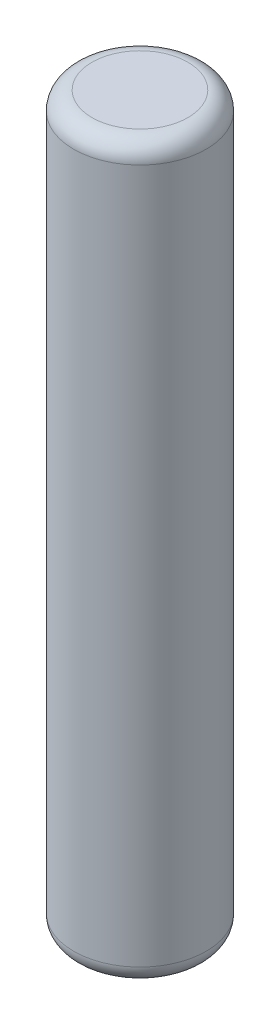
ISO-10303-21;
HEADER;
FILE_DESCRIPTION(('STEP AP214'),'2;1');
FILE_NAME('part.step','',(''),(''),'','','');
FILE_SCHEMA(('AUTOMOTIVE_DESIGN { 1 0 10303 214 1 1 1 1 }'));
ENDSEC;
DATA;
#1=APPLICATION_CONTEXT('core data for automotive mechanical design processes');
#2=APPLICATION_PROTOCOL_DEFINITION('international standard','automotive_design',2000,#1);
#3=PRODUCT_CONTEXT('',#1,'mechanical');
#4=PRODUCT('Part','Part','',(#3));
#5=PRODUCT_RELATED_PRODUCT_CATEGORY('part','',(#4));
#6=PRODUCT_DEFINITION_FORMATION('','',#4);
#7=PRODUCT_DEFINITION_CONTEXT('part definition',#1,'design');
#8=PRODUCT_DEFINITION('design','',#6,#7);
#9=PRODUCT_DEFINITION_SHAPE('','',#8);
#10=(LENGTH_UNIT() NAMED_UNIT(*) SI_UNIT(.MILLI.,.METRE.));
#11=(NAMED_UNIT(*) PLANE_ANGLE_UNIT() SI_UNIT($,.RADIAN.));
#12=(NAMED_UNIT(*) SI_UNIT($,.STERADIAN.) SOLID_ANGLE_UNIT());
#13=UNCERTAINTY_MEASURE_WITH_UNIT(LENGTH_MEASURE(1.E-05),#10,'distance_accuracy_value','');
#14=(GEOMETRIC_REPRESENTATION_CONTEXT(3) GLOBAL_UNCERTAINTY_ASSIGNED_CONTEXT((#13)) GLOBAL_UNIT_ASSIGNED_CONTEXT((#10,
#11,#12)) REPRESENTATION_CONTEXT('',''));
#15=CARTESIAN_POINT('',(0.,0.,0.));
#16=DIRECTION('',(0.,0.,1.));
#17=DIRECTION('',(1.,0.,0.));
#18=AXIS2_PLACEMENT_3D('',#15,#16,#17);
#19=CARTESIAN_POINT('',(0.,40.,0.));
#20=DIRECTION('',(0.,-1.,0.));
#21=DIRECTION('',(0.,0.,-1.));
#22=AXIS2_PLACEMENT_3D('',#19,#20,#21);
#23=CYLINDRICAL_SURFACE('',#22,3.625);
#24=CARTESIAN_POINT('',(0.,1.,0.));
#25=DIRECTION('',(0.,1.,0.));
#26=DIRECTION('',(0.,0.,1.));
#27=AXIS2_PLACEMENT_3D('',#24,#25,#26);
#28=CIRCLE('',#27,3.625);
#29=CARTESIAN_POINT('',(0.,1.,3.625));
#30=VERTEX_POINT('',#29);
#31=EDGE_CURVE('E42',#30,#30,#28,.T.);
#32=ORIENTED_EDGE('',*,*,#31,.T.);
#33=EDGE_LOOP('',(#32));
#34=FACE_BOUND('',#33,.T.);
#35=CARTESIAN_POINT('',(0.,39.,0.));
#36=DIRECTION('',(0.,1.,0.));
#37=DIRECTION('',(0.,0.,1.));
#38=AXIS2_PLACEMENT_3D('',#35,#36,#37);
#39=CIRCLE('',#38,3.625);
#40=CARTESIAN_POINT('',(0.,39.,3.625));
#41=VERTEX_POINT('',#40);
#42=EDGE_CURVE('E48',#41,#41,#39,.F.);
#43=ORIENTED_EDGE('',*,*,#42,.T.);
#44=EDGE_LOOP('',(#43));
#45=FACE_BOUND('',#44,.T.);
#46=ADVANCED_FACE('F40',(#34,#45),#23,.T.);
#47=CARTESIAN_POINT('',(0.,40.,0.));
#48=DIRECTION('',(0.,1.,0.));
#49=DIRECTION('',(0.,0.,1.));
#50=AXIS2_PLACEMENT_3D('',#47,#48,#49);
#51=PLANE('',#50);
#52=CARTESIAN_POINT('',(0.,40.,0.));
#53=DIRECTION('',(0.,1.,0.));
#54=DIRECTION('',(0.,0.,1.));
#55=AXIS2_PLACEMENT_3D('',#52,#53,#54);
#56=CIRCLE('',#55,2.625);
#57=CARTESIAN_POINT('',(0.,40.,2.625));
#58=VERTEX_POINT('',#57);
#59=EDGE_CURVE('E55',#58,#58,#56,.T.);
#60=ORIENTED_EDGE('',*,*,#59,.T.);
#61=EDGE_LOOP('',(#60));
#62=FACE_BOUND('',#61,.T.);
#63=ADVANCED_FACE('F59',(#62),#51,.T.);
#64=CARTESIAN_POINT('',(0.,0.,0.));
#65=DIRECTION('',(0.,1.,0.));
#66=DIRECTION('',(0.,0.,1.));
#67=AXIS2_PLACEMENT_3D('',#64,#65,#66);
#68=PLANE('',#67);
#69=CARTESIAN_POINT('',(0.,0.,0.));
#70=DIRECTION('',(0.,1.,0.));
#71=DIRECTION('',(0.,0.,1.));
#72=AXIS2_PLACEMENT_3D('',#69,#70,#71);
#73=CIRCLE('',#72,2.625);
#74=CARTESIAN_POINT('',(0.,0.,2.625));
#75=VERTEX_POINT('',#74);
#76=EDGE_CURVE('E10',#75,#75,#73,.F.);
#77=ORIENTED_EDGE('',*,*,#76,.T.);
#78=EDGE_LOOP('',(#77));
#79=FACE_BOUND('',#78,.T.);
#80=ADVANCED_FACE('F65',(#79),#68,.F.);
#81=CARTESIAN_POINT('',(0.,39.,0.));
#82=DIRECTION('',(0.,1.,0.));
#83=DIRECTION('',(0.,0.,1.));
#84=AXIS2_PLACEMENT_3D('',#81,#82,#83);
#85=TOROIDAL_SURFACE('',#84,2.625,1.);
#86=ORIENTED_EDGE('',*,*,#42,.F.);
#87=EDGE_LOOP('',(#86));
#88=FACE_BOUND('',#87,.T.);
#89=ORIENTED_EDGE('',*,*,#59,.F.);
#90=EDGE_LOOP('',(#89));
#91=FACE_BOUND('',#90,.T.);
#92=ADVANCED_FACE('F58',(#88,#91),#85,.T.);
#93=CARTESIAN_POINT('',(0.,1.,0.));
#94=DIRECTION('',(0.,1.,0.));
#95=DIRECTION('',(0.,0.,1.));
#96=AXIS2_PLACEMENT_3D('',#93,#94,#95);
#97=TOROIDAL_SURFACE('',#96,2.625,1.);
#98=ORIENTED_EDGE('',*,*,#76,.F.);
#99=EDGE_LOOP('',(#98));
#100=FACE_BOUND('',#99,.T.);
#101=ORIENTED_EDGE('',*,*,#31,.F.);
#102=EDGE_LOOP('',(#101));
#103=FACE_BOUND('',#102,.T.);
#104=ADVANCED_FACE('F39',(#100,#103),#97,.T.);
#105=CLOSED_SHELL('',(#46,#63,#80,#92,#104));
#106=MANIFOLD_SOLID_BREP('B2',#105);
#107=ADVANCED_BREP_SHAPE_REPRESENTATION('',(#18,#106),#14);
#108=SHAPE_DEFINITION_REPRESENTATION(#9,#107);
ENDSEC;
END-ISO-10303-21;
